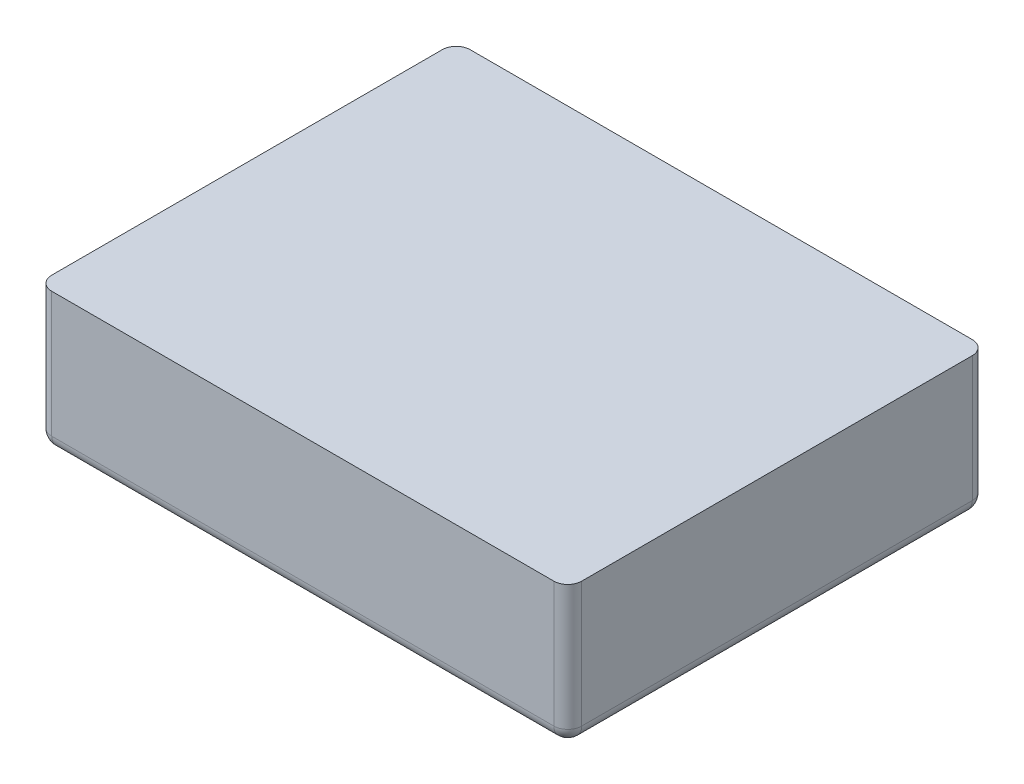
ISO-10303-21;
HEADER;
FILE_DESCRIPTION(('STEP AP214'),'2;1');
FILE_NAME('part.step','',(''),(''),'','','');
FILE_SCHEMA(('AUTOMOTIVE_DESIGN { 1 0 10303 214 1 1 1 1 }'));
ENDSEC;
DATA;
#1=APPLICATION_CONTEXT('core data for automotive mechanical design processes');
#2=APPLICATION_PROTOCOL_DEFINITION('international standard','automotive_design',2000,#1);
#3=PRODUCT_CONTEXT('',#1,'mechanical');
#4=PRODUCT('Part','Part','',(#3));
#5=PRODUCT_RELATED_PRODUCT_CATEGORY('part','',(#4));
#6=PRODUCT_DEFINITION_FORMATION('','',#4);
#7=PRODUCT_DEFINITION_CONTEXT('part definition',#1,'design');
#8=PRODUCT_DEFINITION('design','',#6,#7);
#9=PRODUCT_DEFINITION_SHAPE('','',#8);
#10=(LENGTH_UNIT() NAMED_UNIT(*) SI_UNIT(.MILLI.,.METRE.));
#11=(NAMED_UNIT(*) PLANE_ANGLE_UNIT() SI_UNIT($,.RADIAN.));
#12=(NAMED_UNIT(*) SI_UNIT($,.STERADIAN.) SOLID_ANGLE_UNIT());
#13=UNCERTAINTY_MEASURE_WITH_UNIT(LENGTH_MEASURE(1.E-05),#10,'distance_accuracy_value','');
#14=(GEOMETRIC_REPRESENTATION_CONTEXT(3) GLOBAL_UNCERTAINTY_ASSIGNED_CONTEXT((#13)) GLOBAL_UNIT_ASSIGNED_CONTEXT((#10,
#11,#12)) REPRESENTATION_CONTEXT('',''));
#15=CARTESIAN_POINT('',(0.,0.,0.));
#16=DIRECTION('',(0.,0.,1.));
#17=DIRECTION('',(1.,0.,0.));
#18=AXIS2_PLACEMENT_3D('',#15,#16,#17);
#19=CARTESIAN_POINT('',(0.,-127.,0.));
#20=DIRECTION('',(-1.,0.,0.));
#21=DIRECTION('',(0.,0.,1.));
#22=AXIS2_PLACEMENT_3D('',#19,#20,#21);
#23=PLANE('',#22);
#24=DIRECTION('',(0.,0.,1.));
#25=VECTOR('',#24,1.);
#26=CARTESIAN_POINT('',(0.,0.,0.));
#27=LINE('',#26,#25);
#28=CARTESIAN_POINT('',(0.,0.,-368.3));
#29=VERTEX_POINT('',#28);
#30=CARTESIAN_POINT('',(0.,0.,-12.7));
#31=VERTEX_POINT('',#30);
#32=EDGE_CURVE('E201',#29,#31,#27,.T.);
#33=ORIENTED_EDGE('',*,*,#32,.F.);
#34=DIRECTION('',(0.,1.,0.));
#35=VECTOR('',#34,1.);
#36=CARTESIAN_POINT('',(0.,-127.,-368.3));
#37=LINE('',#36,#35);
#38=CARTESIAN_POINT('',(0.,-114.3,-368.3));
#39=VERTEX_POINT('',#38);
#40=EDGE_CURVE('E154',#29,#39,#37,.F.);
#41=ORIENTED_EDGE('',*,*,#40,.T.);
#42=DIRECTION('',(0.,0.,1.));
#43=VECTOR('',#42,1.);
#44=CARTESIAN_POINT('',(0.,-114.3,0.));
#45=LINE('',#44,#43);
#46=CARTESIAN_POINT('',(0.,-114.3,-12.7));
#47=VERTEX_POINT('',#46);
#48=EDGE_CURVE('E152',#39,#47,#45,.T.);
#49=ORIENTED_EDGE('',*,*,#48,.T.);
#50=DIRECTION('',(0.,1.,0.));
#51=VECTOR('',#50,1.);
#52=CARTESIAN_POINT('',(0.,-127.,-12.7));
#53=LINE('',#52,#51);
#54=EDGE_CURVE('E150',#47,#31,#53,.T.);
#55=ORIENTED_EDGE('',*,*,#54,.T.);
#56=EDGE_LOOP('',(#33,#41,#49,#55));
#57=FACE_BOUND('',#56,.T.);
#58=ADVANCED_FACE('F33',(#57),#23,.T.);
#59=CARTESIAN_POINT('',(0.,-127.,-381.));
#60=DIRECTION('',(0.,0.,-1.));
#61=DIRECTION('',(-1.,0.,0.));
#62=AXIS2_PLACEMENT_3D('',#59,#60,#61);
#63=PLANE('',#62);
#64=DIRECTION('',(-1.,0.,0.));
#65=VECTOR('',#64,1.);
#66=CARTESIAN_POINT('',(0.,0.,-381.));
#67=LINE('',#66,#65);
#68=CARTESIAN_POINT('',(469.9,0.,-381.));
#69=VERTEX_POINT('',#68);
#70=CARTESIAN_POINT('',(12.7,0.,-381.));
#71=VERTEX_POINT('',#70);
#72=EDGE_CURVE('E126',#69,#71,#67,.T.);
#73=ORIENTED_EDGE('',*,*,#72,.F.);
#74=DIRECTION('',(0.,1.,0.));
#75=VECTOR('',#74,1.);
#76=CARTESIAN_POINT('',(469.9,-127.,-381.));
#77=LINE('',#76,#75);
#78=CARTESIAN_POINT('',(469.9,-114.3,-381.));
#79=VERTEX_POINT('',#78);
#80=EDGE_CURVE('E148',#69,#79,#77,.F.);
#81=ORIENTED_EDGE('',*,*,#80,.T.);
#82=DIRECTION('',(-1.,0.,0.));
#83=VECTOR('',#82,1.);
#84=CARTESIAN_POINT('',(0.,-114.3,-381.));
#85=LINE('',#84,#83);
#86=CARTESIAN_POINT('',(12.7,-114.3,-381.));
#87=VERTEX_POINT('',#86);
#88=EDGE_CURVE('E144',#79,#87,#85,.T.);
#89=ORIENTED_EDGE('',*,*,#88,.T.);
#90=DIRECTION('',(0.,1.,0.));
#91=VECTOR('',#90,1.);
#92=CARTESIAN_POINT('',(12.7,-127.,-381.));
#93=LINE('',#92,#91);
#94=EDGE_CURVE('E146',#87,#71,#93,.T.);
#95=ORIENTED_EDGE('',*,*,#94,.T.);
#96=EDGE_LOOP('',(#73,#81,#89,#95));
#97=FACE_BOUND('',#96,.T.);
#98=ADVANCED_FACE('F235',(#97),#63,.T.);
#99=CARTESIAN_POINT('',(482.6,-127.,0.));
#100=DIRECTION('',(1.,0.,0.));
#101=DIRECTION('',(0.,0.,-1.));
#102=AXIS2_PLACEMENT_3D('',#99,#100,#101);
#103=PLANE('',#102);
#104=DIRECTION('',(0.,0.,-1.));
#105=VECTOR('',#104,1.);
#106=CARTESIAN_POINT('',(482.6,-114.3,0.));
#107=LINE('',#106,#105);
#108=CARTESIAN_POINT('',(482.6,-114.3,-12.7));
#109=VERTEX_POINT('',#108);
#110=CARTESIAN_POINT('',(482.6,-114.3,-368.3));
#111=VERTEX_POINT('',#110);
#112=EDGE_CURVE('E132',#109,#111,#107,.T.);
#113=ORIENTED_EDGE('',*,*,#112,.T.);
#114=DIRECTION('',(0.,1.,0.));
#115=VECTOR('',#114,1.);
#116=CARTESIAN_POINT('',(482.6,-127.,-368.3));
#117=LINE('',#116,#115);
#118=CARTESIAN_POINT('',(482.6,0.,-368.3));
#119=VERTEX_POINT('',#118);
#120=EDGE_CURVE('E118',#111,#119,#117,.T.);
#121=ORIENTED_EDGE('',*,*,#120,.T.);
#122=DIRECTION('',(0.,0.,-1.));
#123=VECTOR('',#122,1.);
#124=CARTESIAN_POINT('',(482.6,0.,0.));
#125=LINE('',#124,#123);
#126=CARTESIAN_POINT('',(482.6,0.,-12.7));
#127=VERTEX_POINT('',#126);
#128=EDGE_CURVE('E113',#127,#119,#125,.T.);
#129=ORIENTED_EDGE('',*,*,#128,.F.);
#130=DIRECTION('',(0.,1.,0.));
#131=VECTOR('',#130,1.);
#132=CARTESIAN_POINT('',(482.6,-127.,-12.7));
#133=LINE('',#132,#131);
#134=EDGE_CURVE('E123',#127,#109,#133,.F.);
#135=ORIENTED_EDGE('',*,*,#134,.T.);
#136=EDGE_LOOP('',(#113,#121,#129,#135));
#137=FACE_BOUND('',#136,.T.);
#138=ADVANCED_FACE('F122',(#137),#103,.T.);
#139=CARTESIAN_POINT('',(0.,-127.,0.));
#140=DIRECTION('',(0.,0.,1.));
#141=DIRECTION('',(1.,0.,0.));
#142=AXIS2_PLACEMENT_3D('',#139,#140,#141);
#143=PLANE('',#142);
#144=DIRECTION('',(1.,0.,0.));
#145=VECTOR('',#144,1.);
#146=CARTESIAN_POINT('',(0.,0.,0.));
#147=LINE('',#146,#145);
#148=CARTESIAN_POINT('',(12.7,0.,0.));
#149=VERTEX_POINT('',#148);
#150=CARTESIAN_POINT('',(469.9,0.,0.));
#151=VERTEX_POINT('',#150);
#152=EDGE_CURVE('E114',#149,#151,#147,.T.);
#153=ORIENTED_EDGE('',*,*,#152,.F.);
#154=DIRECTION('',(0.,1.,0.));
#155=VECTOR('',#154,1.);
#156=CARTESIAN_POINT('',(12.7,-127.,0.));
#157=LINE('',#156,#155);
#158=CARTESIAN_POINT('',(12.7,-114.3,0.));
#159=VERTEX_POINT('',#158);
#160=EDGE_CURVE('E11',#149,#159,#157,.F.);
#161=ORIENTED_EDGE('',*,*,#160,.T.);
#162=DIRECTION('',(1.,0.,0.));
#163=VECTOR('',#162,1.);
#164=CARTESIAN_POINT('',(0.,-114.3,0.));
#165=LINE('',#164,#163);
#166=CARTESIAN_POINT('',(469.9,-114.3,0.));
#167=VERTEX_POINT('',#166);
#168=EDGE_CURVE('E42',#159,#167,#165,.T.);
#169=ORIENTED_EDGE('',*,*,#168,.T.);
#170=DIRECTION('',(0.,1.,0.));
#171=VECTOR('',#170,1.);
#172=CARTESIAN_POINT('',(469.9,-127.,0.));
#173=LINE('',#172,#171);
#174=EDGE_CURVE('E165',#167,#151,#173,.T.);
#175=ORIENTED_EDGE('',*,*,#174,.T.);
#176=EDGE_LOOP('',(#153,#161,#169,#175));
#177=FACE_BOUND('',#176,.T.);
#178=ADVANCED_FACE('F259',(#177),#143,.T.);
#179=CARTESIAN_POINT('',(0.,-127.,-381.));
#180=DIRECTION('',(0.,-1.,0.));
#181=DIRECTION('',(0.,0.,-1.));
#182=AXIS2_PLACEMENT_3D('',#179,#180,#181);
#183=PLANE('',#182);
#184=DIRECTION('',(0.,0.,1.));
#185=VECTOR('',#184,1.);
#186=CARTESIAN_POINT('',(12.7,-127.,-381.));
#187=LINE('',#186,#185);
#188=CARTESIAN_POINT('',(12.7,-127.,-12.7));
#189=VERTEX_POINT('',#188);
#190=CARTESIAN_POINT('',(12.7,-127.,-368.3));
#191=VERTEX_POINT('',#190);
#192=EDGE_CURVE('E160',#189,#191,#187,.F.);
#193=ORIENTED_EDGE('',*,*,#192,.T.);
#194=DIRECTION('',(-1.,0.,0.));
#195=VECTOR('',#194,1.);
#196=CARTESIAN_POINT('',(0.,-127.,-368.3));
#197=LINE('',#196,#195);
#198=CARTESIAN_POINT('',(469.9,-127.,-368.3));
#199=VERTEX_POINT('',#198);
#200=EDGE_CURVE('E162',#191,#199,#197,.F.);
#201=ORIENTED_EDGE('',*,*,#200,.T.);
#202=DIRECTION('',(0.,0.,-1.));
#203=VECTOR('',#202,1.);
#204=CARTESIAN_POINT('',(469.9,-127.,-381.));
#205=LINE('',#204,#203);
#206=CARTESIAN_POINT('',(469.9,-127.,-12.7));
#207=VERTEX_POINT('',#206);
#208=EDGE_CURVE('E158',#199,#207,#205,.F.);
#209=ORIENTED_EDGE('',*,*,#208,.T.);
#210=DIRECTION('',(1.,0.,0.));
#211=VECTOR('',#210,1.);
#212=CARTESIAN_POINT('',(0.,-127.,-12.7));
#213=LINE('',#212,#211);
#214=EDGE_CURVE('E156',#207,#189,#213,.F.);
#215=ORIENTED_EDGE('',*,*,#214,.T.);
#216=EDGE_LOOP('',(#193,#201,#209,#215));
#217=FACE_BOUND('',#216,.T.);
#218=ADVANCED_FACE('F249',(#217),#183,.T.);
#219=CARTESIAN_POINT('',(0.,0.,-381.));
#220=DIRECTION('',(0.,-1.,0.));
#221=DIRECTION('',(0.,0.,-1.));
#222=AXIS2_PLACEMENT_3D('',#219,#220,#221);
#223=PLANE('',#222);
#224=ORIENTED_EDGE('',*,*,#128,.T.);
#225=CARTESIAN_POINT('',(469.9,0.,-368.3));
#226=DIRECTION('',(0.,-1.,0.));
#227=DIRECTION('',(0.,0.,-1.));
#228=AXIS2_PLACEMENT_3D('',#225,#226,#227);
#229=CIRCLE('',#228,12.7);
#230=EDGE_CURVE('E142',#119,#69,#229,.F.);
#231=ORIENTED_EDGE('',*,*,#230,.T.);
#232=ORIENTED_EDGE('',*,*,#72,.T.);
#233=CARTESIAN_POINT('',(12.7,0.,-368.3));
#234=DIRECTION('',(0.,-1.,0.));
#235=DIRECTION('',(0.,0.,-1.));
#236=AXIS2_PLACEMENT_3D('',#233,#234,#235);
#237=CIRCLE('',#236,12.7);
#238=EDGE_CURVE('E140',#71,#29,#237,.F.);
#239=ORIENTED_EDGE('',*,*,#238,.T.);
#240=ORIENTED_EDGE('',*,*,#32,.T.);
#241=CARTESIAN_POINT('',(12.7,0.,-12.7));
#242=DIRECTION('',(0.,-1.,0.));
#243=DIRECTION('',(0.,0.,-1.));
#244=AXIS2_PLACEMENT_3D('',#241,#242,#243);
#245=CIRCLE('',#244,12.7);
#246=EDGE_CURVE('E117',#31,#149,#245,.F.);
#247=ORIENTED_EDGE('',*,*,#246,.T.);
#248=ORIENTED_EDGE('',*,*,#152,.T.);
#249=CARTESIAN_POINT('',(469.9,0.,-12.7));
#250=DIRECTION('',(0.,-1.,0.));
#251=DIRECTION('',(0.,0.,-1.));
#252=AXIS2_PLACEMENT_3D('',#249,#250,#251);
#253=CIRCLE('',#252,12.7);
#254=EDGE_CURVE('E110',#151,#127,#253,.F.);
#255=ORIENTED_EDGE('',*,*,#254,.T.);
#256=EDGE_LOOP('',(#224,#231,#232,#239,#240,#247,#248,#255));
#257=FACE_BOUND('',#256,.T.);
#258=ADVANCED_FACE('F112',(#257),#223,.F.);
#259=CARTESIAN_POINT('',(12.7,-127.,-12.7));
#260=DIRECTION('',(0.,1.,0.));
#261=DIRECTION('',(0.,0.,1.));
#262=AXIS2_PLACEMENT_3D('',#259,#260,#261);
#263=CYLINDRICAL_SURFACE('',#262,12.7);
#264=CARTESIAN_POINT('',(12.7,-114.3,-12.7));
#265=DIRECTION('',(0.,-1.,0.));
#266=DIRECTION('',(0.,0.,-1.));
#267=AXIS2_PLACEMENT_3D('',#264,#265,#266);
#268=CIRCLE('',#267,12.7);
#269=EDGE_CURVE('E37',#159,#47,#268,.T.);
#270=ORIENTED_EDGE('',*,*,#269,.F.);
#271=ORIENTED_EDGE('',*,*,#160,.F.);
#272=ORIENTED_EDGE('',*,*,#246,.F.);
#273=ORIENTED_EDGE('',*,*,#54,.F.);
#274=EDGE_LOOP('',(#270,#271,#272,#273));
#275=FACE_BOUND('',#274,.T.);
#276=ADVANCED_FACE('F35',(#275),#263,.T.);
#277=CARTESIAN_POINT('',(12.7,-114.3,-12.7));
#278=DIRECTION('',(0.,0.,1.));
#279=DIRECTION('',(1.,0.,0.));
#280=AXIS2_PLACEMENT_3D('',#277,#278,#279);
#281=SPHERICAL_SURFACE('',#280,12.7);
#282=CARTESIAN_POINT('',(12.7,-114.3,-12.7));
#283=DIRECTION('',(-1.,0.,0.));
#284=DIRECTION('',(0.,0.,1.));
#285=AXIS2_PLACEMENT_3D('',#282,#283,#284);
#286=CIRCLE('',#285,12.7);
#287=EDGE_CURVE('E192',#159,#189,#286,.F.);
#288=ORIENTED_EDGE('',*,*,#287,.F.);
#289=ORIENTED_EDGE('',*,*,#269,.T.);
#290=CARTESIAN_POINT('',(12.7,-114.3,-12.7));
#291=DIRECTION('',(0.,0.,1.));
#292=DIRECTION('',(1.,0.,0.));
#293=AXIS2_PLACEMENT_3D('',#290,#291,#292);
#294=CIRCLE('',#293,12.7);
#295=EDGE_CURVE('E194',#189,#47,#294,.F.);
#296=ORIENTED_EDGE('',*,*,#295,.F.);
#297=EDGE_LOOP('',(#288,#289,#296));
#298=FACE_BOUND('',#297,.T.);
#299=ADVANCED_FACE('F214',(#298),#281,.T.);
#300=CARTESIAN_POINT('',(12.7,-127.,-368.3));
#301=DIRECTION('',(0.,1.,0.));
#302=DIRECTION('',(0.,0.,1.));
#303=AXIS2_PLACEMENT_3D('',#300,#301,#302);
#304=CYLINDRICAL_SURFACE('',#303,12.7);
#305=ORIENTED_EDGE('',*,*,#238,.F.);
#306=ORIENTED_EDGE('',*,*,#94,.F.);
#307=CARTESIAN_POINT('',(12.7,-114.3,-368.3));
#308=DIRECTION('',(0.,-1.,0.));
#309=DIRECTION('',(0.,0.,-1.));
#310=AXIS2_PLACEMENT_3D('',#307,#308,#309);
#311=CIRCLE('',#310,12.7);
#312=EDGE_CURVE('E189',#39,#87,#311,.T.);
#313=ORIENTED_EDGE('',*,*,#312,.F.);
#314=ORIENTED_EDGE('',*,*,#40,.F.);
#315=EDGE_LOOP('',(#305,#306,#313,#314));
#316=FACE_BOUND('',#315,.T.);
#317=ADVANCED_FACE('F240',(#316),#304,.T.);
#318=CARTESIAN_POINT('',(12.7,-114.3,0.));
#319=DIRECTION('',(0.,0.,1.));
#320=DIRECTION('',(1.,0.,0.));
#321=AXIS2_PLACEMENT_3D('',#318,#319,#320);
#322=CYLINDRICAL_SURFACE('',#321,12.7);
#323=ORIENTED_EDGE('',*,*,#295,.T.);
#324=ORIENTED_EDGE('',*,*,#48,.F.);
#325=CARTESIAN_POINT('',(12.7,-114.3,-368.3));
#326=DIRECTION('',(0.,0.,-1.));
#327=DIRECTION('',(-1.,0.,0.));
#328=AXIS2_PLACEMENT_3D('',#325,#326,#327);
#329=CIRCLE('',#328,12.7);
#330=EDGE_CURVE('E186',#191,#39,#329,.T.);
#331=ORIENTED_EDGE('',*,*,#330,.F.);
#332=ORIENTED_EDGE('',*,*,#192,.F.);
#333=EDGE_LOOP('',(#323,#324,#331,#332));
#334=FACE_BOUND('',#333,.T.);
#335=ADVANCED_FACE('F250',(#334),#322,.T.);
#336=CARTESIAN_POINT('',(0.,-114.3,-12.7));
#337=DIRECTION('',(1.,0.,0.));
#338=DIRECTION('',(0.,0.,-1.));
#339=AXIS2_PLACEMENT_3D('',#336,#337,#338);
#340=CYLINDRICAL_SURFACE('',#339,12.7);
#341=ORIENTED_EDGE('',*,*,#287,.T.);
#342=ORIENTED_EDGE('',*,*,#214,.F.);
#343=CARTESIAN_POINT('',(469.9,-114.3,-12.7));
#344=DIRECTION('',(1.,0.,0.));
#345=DIRECTION('',(0.,0.,-1.));
#346=AXIS2_PLACEMENT_3D('',#343,#344,#345);
#347=CIRCLE('',#346,12.7);
#348=EDGE_CURVE('E183',#167,#207,#347,.T.);
#349=ORIENTED_EDGE('',*,*,#348,.F.);
#350=ORIENTED_EDGE('',*,*,#168,.F.);
#351=EDGE_LOOP('',(#341,#342,#349,#350));
#352=FACE_BOUND('',#351,.T.);
#353=ADVANCED_FACE('F218',(#352),#340,.T.);
#354=CARTESIAN_POINT('',(469.9,-127.,-12.7));
#355=DIRECTION('',(0.,1.,0.));
#356=DIRECTION('',(0.,0.,1.));
#357=AXIS2_PLACEMENT_3D('',#354,#355,#356);
#358=CYLINDRICAL_SURFACE('',#357,12.7);
#359=ORIENTED_EDGE('',*,*,#254,.F.);
#360=ORIENTED_EDGE('',*,*,#174,.F.);
#361=CARTESIAN_POINT('',(469.9,-114.3,-12.7));
#362=DIRECTION('',(0.,-1.,0.));
#363=DIRECTION('',(0.,0.,-1.));
#364=AXIS2_PLACEMENT_3D('',#361,#362,#363);
#365=CIRCLE('',#364,12.7);
#366=EDGE_CURVE('E130',#109,#167,#365,.T.);
#367=ORIENTED_EDGE('',*,*,#366,.F.);
#368=ORIENTED_EDGE('',*,*,#134,.F.);
#369=EDGE_LOOP('',(#359,#360,#367,#368));
#370=FACE_BOUND('',#369,.T.);
#371=ADVANCED_FACE('F128',(#370),#358,.T.);
#372=CARTESIAN_POINT('',(12.7,-114.3,-368.3));
#373=DIRECTION('',(0.,0.,1.));
#374=DIRECTION('',(1.,0.,0.));
#375=AXIS2_PLACEMENT_3D('',#372,#373,#374);
#376=SPHERICAL_SURFACE('',#375,12.7);
#377=ORIENTED_EDGE('',*,*,#330,.T.);
#378=ORIENTED_EDGE('',*,*,#312,.T.);
#379=CARTESIAN_POINT('',(12.7,-114.3,-368.3));
#380=DIRECTION('',(-1.,0.,0.));
#381=DIRECTION('',(0.,0.,1.));
#382=AXIS2_PLACEMENT_3D('',#379,#380,#381);
#383=CIRCLE('',#382,12.7);
#384=EDGE_CURVE('E179',#191,#87,#383,.F.);
#385=ORIENTED_EDGE('',*,*,#384,.F.);
#386=EDGE_LOOP('',(#377,#378,#385));
#387=FACE_BOUND('',#386,.T.);
#388=ADVANCED_FACE('F243',(#387),#376,.T.);
#389=CARTESIAN_POINT('',(469.9,-114.3,-12.7));
#390=DIRECTION('',(0.,0.,1.));
#391=DIRECTION('',(1.,0.,0.));
#392=AXIS2_PLACEMENT_3D('',#389,#390,#391);
#393=SPHERICAL_SURFACE('',#392,12.7);
#394=ORIENTED_EDGE('',*,*,#366,.T.);
#395=ORIENTED_EDGE('',*,*,#348,.T.);
#396=CARTESIAN_POINT('',(469.9,-114.3,-12.7));
#397=DIRECTION('',(0.,0.,1.));
#398=DIRECTION('',(1.,0.,0.));
#399=AXIS2_PLACEMENT_3D('',#396,#397,#398);
#400=CIRCLE('',#399,12.7);
#401=EDGE_CURVE('E176',#109,#207,#400,.F.);
#402=ORIENTED_EDGE('',*,*,#401,.F.);
#403=EDGE_LOOP('',(#394,#395,#402));
#404=FACE_BOUND('',#403,.T.);
#405=ADVANCED_FACE('F220',(#404),#393,.T.);
#406=CARTESIAN_POINT('',(0.,-114.3,-368.3));
#407=DIRECTION('',(-1.,0.,0.));
#408=DIRECTION('',(0.,0.,1.));
#409=AXIS2_PLACEMENT_3D('',#406,#407,#408);
#410=CYLINDRICAL_SURFACE('',#409,12.7);
#411=ORIENTED_EDGE('',*,*,#384,.T.);
#412=ORIENTED_EDGE('',*,*,#88,.F.);
#413=CARTESIAN_POINT('',(469.9,-114.3,-368.3));
#414=DIRECTION('',(1.,0.,0.));
#415=DIRECTION('',(0.,0.,-1.));
#416=AXIS2_PLACEMENT_3D('',#413,#414,#415);
#417=CIRCLE('',#416,12.7);
#418=EDGE_CURVE('E173',#199,#79,#417,.T.);
#419=ORIENTED_EDGE('',*,*,#418,.F.);
#420=ORIENTED_EDGE('',*,*,#200,.F.);
#421=EDGE_LOOP('',(#411,#412,#419,#420));
#422=FACE_BOUND('',#421,.T.);
#423=ADVANCED_FACE('F247',(#422),#410,.T.);
#424=CARTESIAN_POINT('',(469.9,-114.3,0.));
#425=DIRECTION('',(0.,0.,-1.));
#426=DIRECTION('',(-1.,0.,0.));
#427=AXIS2_PLACEMENT_3D('',#424,#425,#426);
#428=CYLINDRICAL_SURFACE('',#427,12.7);
#429=ORIENTED_EDGE('',*,*,#401,.T.);
#430=ORIENTED_EDGE('',*,*,#208,.F.);
#431=CARTESIAN_POINT('',(469.9,-114.3,-368.3));
#432=DIRECTION('',(0.,0.,-1.));
#433=DIRECTION('',(-1.,0.,0.));
#434=AXIS2_PLACEMENT_3D('',#431,#432,#433);
#435=CIRCLE('',#434,12.7);
#436=EDGE_CURVE('E171',#111,#199,#435,.T.);
#437=ORIENTED_EDGE('',*,*,#436,.F.);
#438=ORIENTED_EDGE('',*,*,#112,.F.);
#439=EDGE_LOOP('',(#429,#430,#437,#438));
#440=FACE_BOUND('',#439,.T.);
#441=ADVANCED_FACE('F225',(#440),#428,.T.);
#442=CARTESIAN_POINT('',(469.9,-114.3,-368.3));
#443=DIRECTION('',(0.,0.,1.));
#444=DIRECTION('',(1.,0.,0.));
#445=AXIS2_PLACEMENT_3D('',#442,#443,#444);
#446=SPHERICAL_SURFACE('',#445,12.7);
#447=ORIENTED_EDGE('',*,*,#436,.T.);
#448=ORIENTED_EDGE('',*,*,#418,.T.);
#449=CARTESIAN_POINT('',(469.9,-114.3,-368.3));
#450=DIRECTION('',(0.,-1.,0.));
#451=DIRECTION('',(0.,0.,-1.));
#452=AXIS2_PLACEMENT_3D('',#449,#450,#451);
#453=CIRCLE('',#452,12.7);
#454=EDGE_CURVE('E168',#111,#79,#453,.F.);
#455=ORIENTED_EDGE('',*,*,#454,.F.);
#456=EDGE_LOOP('',(#447,#448,#455));
#457=FACE_BOUND('',#456,.T.);
#458=ADVANCED_FACE('F229',(#457),#446,.T.);
#459=CARTESIAN_POINT('',(469.9,-127.,-368.3));
#460=DIRECTION('',(0.,1.,0.));
#461=DIRECTION('',(0.,0.,1.));
#462=AXIS2_PLACEMENT_3D('',#459,#460,#461);
#463=CYLINDRICAL_SURFACE('',#462,12.7);
#464=ORIENTED_EDGE('',*,*,#454,.T.);
#465=ORIENTED_EDGE('',*,*,#80,.F.);
#466=ORIENTED_EDGE('',*,*,#230,.F.);
#467=ORIENTED_EDGE('',*,*,#120,.F.);
#468=EDGE_LOOP('',(#464,#465,#466,#467));
#469=FACE_BOUND('',#468,.T.);
#470=ADVANCED_FACE('F232',(#469),#463,.T.);
#471=CLOSED_SHELL('',(#58,#98,#138,#178,#218,#258,#276,#299,#317,#335,#353,#371,#388,#405,#423,
#441,#458,#470));
#472=MANIFOLD_SOLID_BREP('B2',#471);
#473=ADVANCED_BREP_SHAPE_REPRESENTATION('',(#18,#472),#14);
#474=SHAPE_DEFINITION_REPRESENTATION(#9,#473);
ENDSEC;
END-ISO-10303-21;
